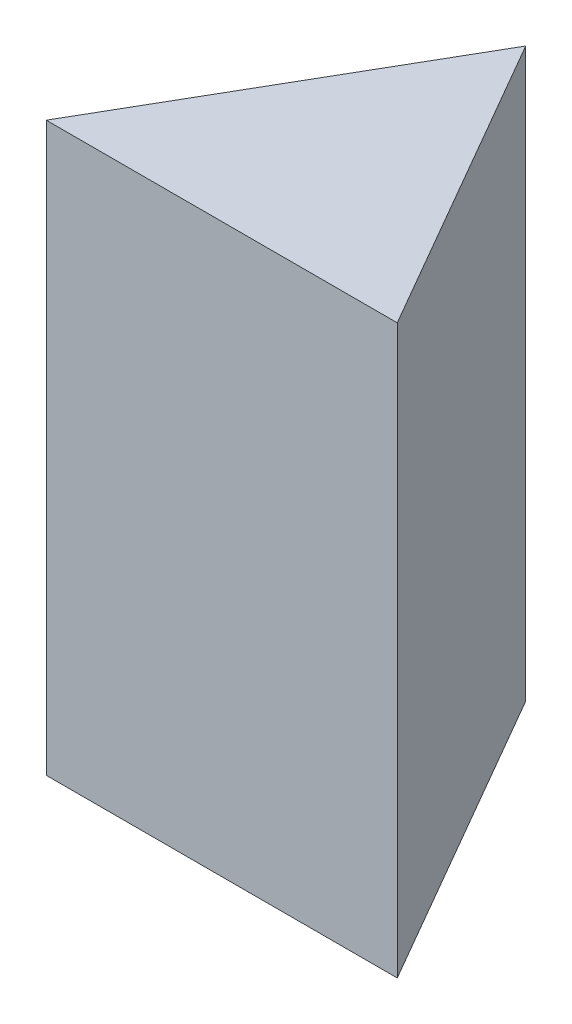
ISO-10303-21;
HEADER;
FILE_DESCRIPTION(('STEP AP214'),'2;1');
FILE_NAME('part.step','',(''),(''),'','','');
FILE_SCHEMA(('AUTOMOTIVE_DESIGN { 1 0 10303 214 1 1 1 1 }'));
ENDSEC;
DATA;
#1=APPLICATION_CONTEXT('core data for automotive mechanical design processes');
#2=APPLICATION_PROTOCOL_DEFINITION('international standard','automotive_design',2000,#1);
#3=PRODUCT_CONTEXT('',#1,'mechanical');
#4=PRODUCT('Part','Part','',(#3));
#5=PRODUCT_RELATED_PRODUCT_CATEGORY('part','',(#4));
#6=PRODUCT_DEFINITION_FORMATION('','',#4);
#7=PRODUCT_DEFINITION_CONTEXT('part definition',#1,'design');
#8=PRODUCT_DEFINITION('design','',#6,#7);
#9=PRODUCT_DEFINITION_SHAPE('','',#8);
#10=(LENGTH_UNIT() NAMED_UNIT(*) SI_UNIT(.MILLI.,.METRE.));
#11=(NAMED_UNIT(*) PLANE_ANGLE_UNIT() SI_UNIT($,.RADIAN.));
#12=(NAMED_UNIT(*) SI_UNIT($,.STERADIAN.) SOLID_ANGLE_UNIT());
#13=UNCERTAINTY_MEASURE_WITH_UNIT(LENGTH_MEASURE(1.E-05),#10,'distance_accuracy_value','');
#14=(GEOMETRIC_REPRESENTATION_CONTEXT(3) GLOBAL_UNCERTAINTY_ASSIGNED_CONTEXT((#13)) GLOBAL_UNIT_ASSIGNED_CONTEXT((#10,
#11,#12)) REPRESENTATION_CONTEXT('',''));
#15=CARTESIAN_POINT('',(0.,0.,0.));
#16=DIRECTION('',(0.,0.,1.));
#17=DIRECTION('',(1.,0.,0.));
#18=AXIS2_PLACEMENT_3D('',#15,#16,#17);
#19=CARTESIAN_POINT('',(0.,70.,0.));
#20=DIRECTION('',(0.,-1.,0.));
#21=DIRECTION('',(0.,0.,-1.));
#22=AXIS2_PLACEMENT_3D('',#19,#20,#21);
#23=PLANE('',#22);
#24=DIRECTION('',(-0.499999999999998,0.,0.86602540378444));
#25=VECTOR('',#24,1.);
#26=CARTESIAN_POINT('',(-21.6506350946109,70.,12.5000000000001));
#27=LINE('',#26,#25);
#28=CARTESIAN_POINT('',(0.,70.,-25.));
#29=VERTEX_POINT('',#28);
#30=CARTESIAN_POINT('',(-21.6506350946109,70.,12.5000000000001));
#31=VERTEX_POINT('',#30);
#32=EDGE_CURVE('E187',#29,#31,#27,.T.);
#33=ORIENTED_EDGE('',*,*,#32,.T.);
#34=DIRECTION('',(1.,0.,0.));
#35=VECTOR('',#34,1.);
#36=CARTESIAN_POINT('',(21.6506350946109,70.,12.5000000000001));
#37=LINE('',#36,#35);
#38=CARTESIAN_POINT('',(21.6506350946109,70.,12.5000000000001));
#39=VERTEX_POINT('',#38);
#40=EDGE_CURVE('E191',#31,#39,#37,.T.);
#41=ORIENTED_EDGE('',*,*,#40,.T.);
#42=DIRECTION('',(-0.499999999999998,0.,-0.86602540378444));
#43=VECTOR('',#42,1.);
#44=CARTESIAN_POINT('',(0.,70.,-25.));
#45=LINE('',#44,#43);
#46=EDGE_CURVE('E195',#39,#29,#45,.T.);
#47=ORIENTED_EDGE('',*,*,#46,.T.);
#48=EDGE_LOOP('',(#33,#41,#47));
#49=FACE_BOUND('',#48,.T.);
#50=ADVANCED_FACE('F43',(#49),#23,.F.);
#51=CARTESIAN_POINT('',(0.,0.,0.));
#52=DIRECTION('',(0.,-1.,0.));
#53=DIRECTION('',(0.,0.,-1.));
#54=AXIS2_PLACEMENT_3D('',#51,#52,#53);
#55=PLANE('',#54);
#56=DIRECTION('',(-0.499999999999998,0.,0.86602540378444));
#57=VECTOR('',#56,1.);
#58=CARTESIAN_POINT('',(-21.6506350946109,0.,12.5000000000001));
#59=LINE('',#58,#57);
#60=CARTESIAN_POINT('',(0.,0.,-25.));
#61=VERTEX_POINT('',#60);
#62=CARTESIAN_POINT('',(-21.6506350946109,0.,12.5000000000001));
#63=VERTEX_POINT('',#62);
#64=EDGE_CURVE('E186',#61,#63,#59,.T.);
#65=ORIENTED_EDGE('',*,*,#64,.F.);
#66=DIRECTION('',(-0.499999999999998,0.,-0.86602540378444));
#67=VECTOR('',#66,1.);
#68=CARTESIAN_POINT('',(0.,0.,-25.));
#69=LINE('',#68,#67);
#70=CARTESIAN_POINT('',(21.6506350946109,0.,12.5000000000001));
#71=VERTEX_POINT('',#70);
#72=EDGE_CURVE('E192',#71,#61,#69,.T.);
#73=ORIENTED_EDGE('',*,*,#72,.F.);
#74=DIRECTION('',(1.,0.,0.));
#75=VECTOR('',#74,1.);
#76=CARTESIAN_POINT('',(21.6506350946109,0.,12.5000000000001));
#77=LINE('',#76,#75);
#78=EDGE_CURVE('E202',#63,#71,#77,.T.);
#79=ORIENTED_EDGE('',*,*,#78,.F.);
#80=EDGE_LOOP('',(#65,#73,#79));
#81=FACE_BOUND('',#80,.T.);
#82=DIRECTION('',(-1.,0.,0.));
#83=VECTOR('',#82,1.);
#84=CARTESIAN_POINT('',(-7.79422863405989,0.,4.50000000000011));
#85=LINE('',#84,#83);
#86=CARTESIAN_POINT('',(7.79422863406002,0.,4.50000000000011));
#87=VERTEX_POINT('',#86);
#88=CARTESIAN_POINT('',(-7.79422863405989,0.,4.50000000000011));
#89=VERTEX_POINT('',#88);
#90=EDGE_CURVE('E145',#87,#89,#85,.T.);
#91=ORIENTED_EDGE('',*,*,#90,.F.);
#92=DIRECTION('',(0.5,0.,0.866025403784439));
#93=VECTOR('',#92,1.);
#94=CARTESIAN_POINT('',(7.79422863406002,0.,4.50000000000011));
#95=LINE('',#94,#93);
#96=CARTESIAN_POINT('',(0.,0.,-8.9999999999999));
#97=VERTEX_POINT('',#96);
#98=EDGE_CURVE('E123',#97,#87,#95,.T.);
#99=ORIENTED_EDGE('',*,*,#98,.F.);
#100=DIRECTION('',(0.5,0.,-0.866025403784439));
#101=VECTOR('',#100,1.);
#102=CARTESIAN_POINT('',(0.,0.,-8.9999999999999));
#103=LINE('',#102,#101);
#104=EDGE_CURVE('E141',#89,#97,#103,.T.);
#105=ORIENTED_EDGE('',*,*,#104,.F.);
#106=EDGE_LOOP('',(#91,#99,#105));
#107=FACE_BOUND('',#106,.T.);
#108=ADVANCED_FACE('F220',(#81,#107),#55,.T.);
#109=CARTESIAN_POINT('',(-21.6506350946109,70.,12.5000000000001));
#110=DIRECTION('',(0.86602540378444,0.,0.499999999999998));
#111=DIRECTION('',(0.499999999999998,0.,-0.86602540378444));
#112=AXIS2_PLACEMENT_3D('',#109,#110,#111);
#113=PLANE('',#112);
#114=ORIENTED_EDGE('',*,*,#64,.T.);
#115=DIRECTION('',(0.,-1.,0.));
#116=VECTOR('',#115,1.);
#117=CARTESIAN_POINT('',(-21.6506350946109,70.,12.5000000000001));
#118=LINE('',#117,#116);
#119=EDGE_CURVE('E11',#31,#63,#118,.T.);
#120=ORIENTED_EDGE('',*,*,#119,.F.);
#121=ORIENTED_EDGE('',*,*,#32,.F.);
#122=DIRECTION('',(0.,-1.,0.));
#123=VECTOR('',#122,1.);
#124=CARTESIAN_POINT('',(0.,70.,-25.));
#125=LINE('',#124,#123);
#126=EDGE_CURVE('E198',#29,#61,#125,.T.);
#127=ORIENTED_EDGE('',*,*,#126,.T.);
#128=EDGE_LOOP('',(#114,#120,#121,#127));
#129=FACE_BOUND('',#128,.T.);
#130=ADVANCED_FACE('F45',(#129),#113,.F.);
#131=CARTESIAN_POINT('',(21.6506350946109,70.,12.5000000000001));
#132=DIRECTION('',(0.,0.,-1.));
#133=DIRECTION('',(-1.,0.,0.));
#134=AXIS2_PLACEMENT_3D('',#131,#132,#133);
#135=PLANE('',#134);
#136=ORIENTED_EDGE('',*,*,#78,.T.);
#137=DIRECTION('',(0.,-1.,0.));
#138=VECTOR('',#137,1.);
#139=CARTESIAN_POINT('',(21.6506350946109,70.,12.5000000000001));
#140=LINE('',#139,#138);
#141=EDGE_CURVE('E52',#39,#71,#140,.T.);
#142=ORIENTED_EDGE('',*,*,#141,.F.);
#143=ORIENTED_EDGE('',*,*,#40,.F.);
#144=ORIENTED_EDGE('',*,*,#119,.T.);
#145=EDGE_LOOP('',(#136,#142,#143,#144));
#146=FACE_BOUND('',#145,.T.);
#147=ADVANCED_FACE('F226',(#146),#135,.F.);
#148=CARTESIAN_POINT('',(0.,70.,-25.));
#149=DIRECTION('',(-0.86602540378444,0.,0.499999999999998));
#150=DIRECTION('',(0.499999999999998,0.,0.86602540378444));
#151=AXIS2_PLACEMENT_3D('',#148,#149,#150);
#152=PLANE('',#151);
#153=ORIENTED_EDGE('',*,*,#72,.T.);
#154=ORIENTED_EDGE('',*,*,#126,.F.);
#155=ORIENTED_EDGE('',*,*,#46,.F.);
#156=ORIENTED_EDGE('',*,*,#141,.T.);
#157=EDGE_LOOP('',(#153,#154,#155,#156));
#158=FACE_BOUND('',#157,.T.);
#159=ADVANCED_FACE('F215',(#158),#152,.F.);
#160=CARTESIAN_POINT('',(0.,5.,0.));
#161=DIRECTION('',(0.,1.,0.));
#162=DIRECTION('',(0.,0.,1.));
#163=AXIS2_PLACEMENT_3D('',#160,#161,#162);
#164=PLANE('',#163);
#165=DIRECTION('',(0.5,0.,0.866025403784439));
#166=VECTOR('',#165,1.);
#167=CARTESIAN_POINT('',(7.79422863406002,5.,4.50000000000011));
#168=LINE('',#167,#166);
#169=CARTESIAN_POINT('',(0.,5.,-8.9999999999999));
#170=VERTEX_POINT('',#169);
#171=CARTESIAN_POINT('',(7.79422863406002,5.,4.50000000000011));
#172=VERTEX_POINT('',#171);
#173=EDGE_CURVE('E120',#170,#172,#168,.T.);
#174=ORIENTED_EDGE('',*,*,#173,.T.);
#175=DIRECTION('',(-1.,0.,0.));
#176=VECTOR('',#175,1.);
#177=CARTESIAN_POINT('',(-7.79422863405989,5.,4.50000000000011));
#178=LINE('',#177,#176);
#179=CARTESIAN_POINT('',(-7.79422863405989,5.,4.50000000000011));
#180=VERTEX_POINT('',#179);
#181=EDGE_CURVE('E133',#172,#180,#178,.T.);
#182=ORIENTED_EDGE('',*,*,#181,.T.);
#183=DIRECTION('',(0.5,0.,-0.866025403784439));
#184=VECTOR('',#183,1.);
#185=CARTESIAN_POINT('',(0.,5.,-8.9999999999999));
#186=LINE('',#185,#184);
#187=EDGE_CURVE('E129',#180,#170,#186,.T.);
#188=ORIENTED_EDGE('',*,*,#187,.T.);
#189=EDGE_LOOP('',(#174,#182,#188));
#190=FACE_BOUND('',#189,.T.);
#191=DIRECTION('',(0.5,0.,-0.866025403784438));
#192=VECTOR('',#191,1.);
#193=CARTESIAN_POINT('',(0.,5.,-18.9999999999999));
#194=LINE('',#193,#192);
#195=CARTESIAN_POINT('',(-16.4544826719043,5.,9.50000000000011));
#196=VERTEX_POINT('',#195);
#197=CARTESIAN_POINT('',(0.,5.,-18.9999999999999));
#198=VERTEX_POINT('',#197);
#199=EDGE_CURVE('E67',#196,#198,#194,.T.);
#200=ORIENTED_EDGE('',*,*,#199,.F.);
#201=DIRECTION('',(-1.,0.,0.));
#202=VECTOR('',#201,1.);
#203=CARTESIAN_POINT('',(-16.4544826719043,5.,9.50000000000011));
#204=LINE('',#203,#202);
#205=CARTESIAN_POINT('',(16.4544826719044,5.,9.50000000000011));
#206=VERTEX_POINT('',#205);
#207=EDGE_CURVE('E163',#206,#196,#204,.T.);
#208=ORIENTED_EDGE('',*,*,#207,.F.);
#209=DIRECTION('',(0.5,0.,0.866025403784438));
#210=VECTOR('',#209,1.);
#211=CARTESIAN_POINT('',(16.4544826719044,5.,9.50000000000011));
#212=LINE('',#211,#210);
#213=EDGE_CURVE('E59',#198,#206,#212,.T.);
#214=ORIENTED_EDGE('',*,*,#213,.F.);
#215=EDGE_LOOP('',(#200,#208,#214));
#216=FACE_BOUND('',#215,.T.);
#217=ADVANCED_FACE('F138',(#190,#216),#164,.T.);
#218=CARTESIAN_POINT('',(7.79422863406002,5.,4.50000000000011));
#219=DIRECTION('',(0.866025403784439,0.,-0.5));
#220=DIRECTION('',(-0.5,0.,-0.866025403784439));
#221=AXIS2_PLACEMENT_3D('',#218,#219,#220);
#222=PLANE('',#221);
#223=ORIENTED_EDGE('',*,*,#98,.T.);
#224=DIRECTION('',(0.,-1.,0.));
#225=VECTOR('',#224,1.);
#226=CARTESIAN_POINT('',(7.79422863406002,5.,4.50000000000011));
#227=LINE('',#226,#225);
#228=EDGE_CURVE('E116',#172,#87,#227,.T.);
#229=ORIENTED_EDGE('',*,*,#228,.F.);
#230=ORIENTED_EDGE('',*,*,#173,.F.);
#231=DIRECTION('',(0.,-1.,0.));
#232=VECTOR('',#231,1.);
#233=CARTESIAN_POINT('',(0.,5.,-8.9999999999999));
#234=LINE('',#233,#232);
#235=EDGE_CURVE('E154',#170,#97,#234,.T.);
#236=ORIENTED_EDGE('',*,*,#235,.T.);
#237=EDGE_LOOP('',(#223,#229,#230,#236));
#238=FACE_BOUND('',#237,.T.);
#239=ADVANCED_FACE('F118',(#238),#222,.F.);
#240=CARTESIAN_POINT('',(0.,5.,-8.9999999999999));
#241=DIRECTION('',(-0.866025403784439,0.,-0.5));
#242=DIRECTION('',(-0.5,0.,0.866025403784439));
#243=AXIS2_PLACEMENT_3D('',#240,#241,#242);
#244=PLANE('',#243);
#245=ORIENTED_EDGE('',*,*,#104,.T.);
#246=ORIENTED_EDGE('',*,*,#235,.F.);
#247=ORIENTED_EDGE('',*,*,#187,.F.);
#248=DIRECTION('',(0.,-1.,0.));
#249=VECTOR('',#248,1.);
#250=CARTESIAN_POINT('',(-7.79422863405989,5.,4.50000000000011));
#251=LINE('',#250,#249);
#252=EDGE_CURVE('E128',#180,#89,#251,.T.);
#253=ORIENTED_EDGE('',*,*,#252,.T.);
#254=EDGE_LOOP('',(#245,#246,#247,#253));
#255=FACE_BOUND('',#254,.T.);
#256=ADVANCED_FACE('F258',(#255),#244,.F.);
#257=CARTESIAN_POINT('',(-7.79422863405989,5.,4.50000000000011));
#258=DIRECTION('',(0.,0.,1.));
#259=DIRECTION('',(1.,0.,0.));
#260=AXIS2_PLACEMENT_3D('',#257,#258,#259);
#261=PLANE('',#260);
#262=ORIENTED_EDGE('',*,*,#90,.T.);
#263=ORIENTED_EDGE('',*,*,#252,.F.);
#264=ORIENTED_EDGE('',*,*,#181,.F.);
#265=ORIENTED_EDGE('',*,*,#228,.T.);
#266=EDGE_LOOP('',(#262,#263,#264,#265));
#267=FACE_BOUND('',#266,.T.);
#268=ADVANCED_FACE('F134',(#267),#261,.F.);
#269=CARTESIAN_POINT('',(0.,65.,0.));
#270=DIRECTION('',(0.,-1.,0.));
#271=DIRECTION('',(0.,0.,-1.));
#272=AXIS2_PLACEMENT_3D('',#269,#270,#271);
#273=PLANE('',#272);
#274=DIRECTION('',(-0.5,0.,0.866025403784439));
#275=VECTOR('',#274,1.);
#276=CARTESIAN_POINT('',(-16.4544826719043,65.,9.50000000000011));
#277=LINE('',#276,#275);
#278=CARTESIAN_POINT('',(0.,65.,-18.9999999999999));
#279=VERTEX_POINT('',#278);
#280=CARTESIAN_POINT('',(-16.4544826719043,65.,9.50000000000011));
#281=VERTEX_POINT('',#280);
#282=EDGE_CURVE('E167',#279,#281,#277,.T.);
#283=ORIENTED_EDGE('',*,*,#282,.F.);
#284=DIRECTION('',(-0.5,0.,-0.866025403784439));
#285=VECTOR('',#284,1.);
#286=CARTESIAN_POINT('',(0.,65.,-18.9999999999999));
#287=LINE('',#286,#285);
#288=CARTESIAN_POINT('',(16.4544826719044,65.,9.50000000000011));
#289=VERTEX_POINT('',#288);
#290=EDGE_CURVE('E173',#289,#279,#287,.T.);
#291=ORIENTED_EDGE('',*,*,#290,.F.);
#292=DIRECTION('',(1.,0.,0.));
#293=VECTOR('',#292,1.);
#294=CARTESIAN_POINT('',(16.4544826719044,65.,9.50000000000011));
#295=LINE('',#294,#293);
#296=EDGE_CURVE('E170',#281,#289,#295,.T.);
#297=ORIENTED_EDGE('',*,*,#296,.F.);
#298=EDGE_LOOP('',(#283,#291,#297));
#299=FACE_BOUND('',#298,.T.);
#300=ADVANCED_FACE('F250',(#299),#273,.T.);
#301=CARTESIAN_POINT('',(-16.4544826719043,70.,9.50000000000011));
#302=DIRECTION('',(0.866025403784439,0.,0.5));
#303=DIRECTION('',(0.5,0.,-0.866025403784439));
#304=AXIS2_PLACEMENT_3D('',#301,#302,#303);
#305=PLANE('',#304);
#306=ORIENTED_EDGE('',*,*,#199,.T.);
#307=DIRECTION('',(0.,-1.,0.));
#308=VECTOR('',#307,1.);
#309=CARTESIAN_POINT('',(0.,70.,-18.9999999999999));
#310=LINE('',#309,#308);
#311=EDGE_CURVE('E180',#279,#198,#310,.T.);
#312=ORIENTED_EDGE('',*,*,#311,.F.);
#313=ORIENTED_EDGE('',*,*,#282,.T.);
#314=DIRECTION('',(0.,-1.,0.));
#315=VECTOR('',#314,1.);
#316=CARTESIAN_POINT('',(-16.4544826719043,70.,9.50000000000011));
#317=LINE('',#316,#315);
#318=EDGE_CURVE('E177',#281,#196,#317,.T.);
#319=ORIENTED_EDGE('',*,*,#318,.T.);
#320=EDGE_LOOP('',(#306,#312,#313,#319));
#321=FACE_BOUND('',#320,.T.);
#322=ADVANCED_FACE('F247',(#321),#305,.T.);
#323=CARTESIAN_POINT('',(0.,70.,-18.9999999999999));
#324=DIRECTION('',(-0.866025403784439,0.,0.5));
#325=DIRECTION('',(0.5,0.,0.866025403784439));
#326=AXIS2_PLACEMENT_3D('',#323,#324,#325);
#327=PLANE('',#326);
#328=ORIENTED_EDGE('',*,*,#213,.T.);
#329=DIRECTION('',(0.,-1.,0.));
#330=VECTOR('',#329,1.);
#331=CARTESIAN_POINT('',(16.4544826719044,70.,9.50000000000011));
#332=LINE('',#331,#330);
#333=EDGE_CURVE('E183',#289,#206,#332,.T.);
#334=ORIENTED_EDGE('',*,*,#333,.F.);
#335=ORIENTED_EDGE('',*,*,#290,.T.);
#336=ORIENTED_EDGE('',*,*,#311,.T.);
#337=EDGE_LOOP('',(#328,#334,#335,#336));
#338=FACE_BOUND('',#337,.T.);
#339=ADVANCED_FACE('F243',(#338),#327,.T.);
#340=CARTESIAN_POINT('',(16.4544826719044,70.,9.50000000000011));
#341=DIRECTION('',(0.,0.,-1.));
#342=DIRECTION('',(-1.,0.,0.));
#343=AXIS2_PLACEMENT_3D('',#340,#341,#342);
#344=PLANE('',#343);
#345=ORIENTED_EDGE('',*,*,#207,.T.);
#346=ORIENTED_EDGE('',*,*,#318,.F.);
#347=ORIENTED_EDGE('',*,*,#296,.T.);
#348=ORIENTED_EDGE('',*,*,#333,.T.);
#349=EDGE_LOOP('',(#345,#346,#347,#348));
#350=FACE_BOUND('',#349,.T.);
#351=ADVANCED_FACE('F240',(#350),#344,.T.);
#352=CLOSED_SHELL('',(#50,#108,#130,#147,#159,#217,#239,#256,#268,#300,#322,#339,#351));
#353=MANIFOLD_SOLID_BREP('B2',#352);
#354=ADVANCED_BREP_SHAPE_REPRESENTATION('',(#18,#353),#14);
#355=SHAPE_DEFINITION_REPRESENTATION(#9,#354);
ENDSEC;
END-ISO-10303-21;
